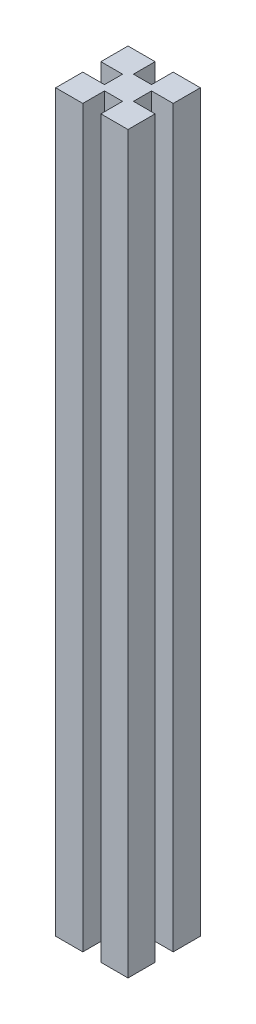
ISO-10303-21;
HEADER;
FILE_DESCRIPTION(('STEP AP214'),'2;1');
FILE_NAME('part.step','',(''),(''),'','','');
FILE_SCHEMA(('AUTOMOTIVE_DESIGN { 1 0 10303 214 1 1 1 1 }'));
ENDSEC;
DATA;
#1=APPLICATION_CONTEXT('core data for automotive mechanical design processes');
#2=APPLICATION_PROTOCOL_DEFINITION('international standard','automotive_design',2000,#1);
#3=PRODUCT_CONTEXT('',#1,'mechanical');
#4=PRODUCT('Part','Part','',(#3));
#5=PRODUCT_RELATED_PRODUCT_CATEGORY('part','',(#4));
#6=PRODUCT_DEFINITION_FORMATION('','',#4);
#7=PRODUCT_DEFINITION_CONTEXT('part definition',#1,'design');
#8=PRODUCT_DEFINITION('design','',#6,#7);
#9=PRODUCT_DEFINITION_SHAPE('','',#8);
#10=(LENGTH_UNIT() NAMED_UNIT(*) SI_UNIT(.MILLI.,.METRE.));
#11=(NAMED_UNIT(*) PLANE_ANGLE_UNIT() SI_UNIT($,.RADIAN.));
#12=(NAMED_UNIT(*) SI_UNIT($,.STERADIAN.) SOLID_ANGLE_UNIT());
#13=UNCERTAINTY_MEASURE_WITH_UNIT(LENGTH_MEASURE(1.E-05),#10,'distance_accuracy_value','');
#14=(GEOMETRIC_REPRESENTATION_CONTEXT(3) GLOBAL_UNCERTAINTY_ASSIGNED_CONTEXT((#13)) GLOBAL_UNIT_ASSIGNED_CONTEXT((#10,
#11,#12)) REPRESENTATION_CONTEXT('',''));
#15=CARTESIAN_POINT('',(0.,0.,0.));
#16=DIRECTION('',(0.,0.,1.));
#17=DIRECTION('',(1.,0.,0.));
#18=AXIS2_PLACEMENT_3D('',#15,#16,#17);
#19=CARTESIAN_POINT('',(10.,-101.6,10.));
#20=DIRECTION('',(1.,0.,0.));
#21=DIRECTION('',(0.,0.,-1.));
#22=AXIS2_PLACEMENT_3D('',#19,#20,#21);
#23=PLANE('',#22);
#24=DIRECTION('',(0.,-1.,0.));
#25=VECTOR('',#24,1.);
#26=CARTESIAN_POINT('',(10.,-101.6,2.5));
#27=LINE('',#26,#25);
#28=CARTESIAN_POINT('',(10.,101.6,2.5));
#29=VERTEX_POINT('',#28);
#30=CARTESIAN_POINT('',(10.,-101.6,2.5));
#31=VERTEX_POINT('',#30);
#32=EDGE_CURVE('E263',#29,#31,#27,.T.);
#33=ORIENTED_EDGE('',*,*,#32,.F.);
#34=DIRECTION('',(0.,0.,-1.));
#35=VECTOR('',#34,1.);
#36=CARTESIAN_POINT('',(10.,101.6,10.));
#37=LINE('',#36,#35);
#38=CARTESIAN_POINT('',(10.,101.6,10.));
#39=VERTEX_POINT('',#38);
#40=EDGE_CURVE('E269',#39,#29,#37,.T.);
#41=ORIENTED_EDGE('',*,*,#40,.F.);
#42=DIRECTION('',(0.,1.,0.));
#43=VECTOR('',#42,1.);
#44=CARTESIAN_POINT('',(10.,-101.6,10.));
#45=LINE('',#44,#43);
#46=CARTESIAN_POINT('',(10.,-101.6,10.));
#47=VERTEX_POINT('',#46);
#48=EDGE_CURVE('E300',#47,#39,#45,.T.);
#49=ORIENTED_EDGE('',*,*,#48,.F.);
#50=DIRECTION('',(0.,0.,-1.));
#51=VECTOR('',#50,1.);
#52=CARTESIAN_POINT('',(10.,-101.6,10.));
#53=LINE('',#52,#51);
#54=EDGE_CURVE('E284',#47,#31,#53,.T.);
#55=ORIENTED_EDGE('',*,*,#54,.T.);
#56=EDGE_LOOP('',(#33,#41,#49,#55));
#57=FACE_BOUND('',#56,.T.);
#58=ADVANCED_FACE('F32',(#57),#23,.T.);
#59=CARTESIAN_POINT('',(-10.,-101.6,10.));
#60=DIRECTION('',(0.,0.,1.));
#61=DIRECTION('',(1.,0.,0.));
#62=AXIS2_PLACEMENT_3D('',#59,#60,#61);
#63=PLANE('',#62);
#64=DIRECTION('',(0.,1.,0.));
#65=VECTOR('',#64,1.);
#66=CARTESIAN_POINT('',(2.5,-101.6,10.));
#67=LINE('',#66,#65);
#68=CARTESIAN_POINT('',(2.5,-101.6,10.));
#69=VERTEX_POINT('',#68);
#70=CARTESIAN_POINT('',(2.5,101.6,10.));
#71=VERTEX_POINT('',#70);
#72=EDGE_CURVE('E256',#69,#71,#67,.T.);
#73=ORIENTED_EDGE('',*,*,#72,.F.);
#74=DIRECTION('',(1.,0.,0.));
#75=VECTOR('',#74,1.);
#76=CARTESIAN_POINT('',(-10.,-101.6,10.));
#77=LINE('',#76,#75);
#78=EDGE_CURVE('E295',#69,#47,#77,.T.);
#79=ORIENTED_EDGE('',*,*,#78,.T.);
#80=ORIENTED_EDGE('',*,*,#48,.T.);
#81=DIRECTION('',(1.,0.,0.));
#82=VECTOR('',#81,1.);
#83=CARTESIAN_POINT('',(-10.,101.6,10.));
#84=LINE('',#83,#82);
#85=EDGE_CURVE('E279',#71,#39,#84,.T.);
#86=ORIENTED_EDGE('',*,*,#85,.F.);
#87=EDGE_LOOP('',(#73,#79,#80,#86));
#88=FACE_BOUND('',#87,.T.);
#89=ADVANCED_FACE('F374',(#88),#63,.T.);
#90=CARTESIAN_POINT('',(-10.,-101.6,10.));
#91=DIRECTION('',(-1.,0.,0.));
#92=DIRECTION('',(0.,0.,1.));
#93=AXIS2_PLACEMENT_3D('',#90,#91,#92);
#94=PLANE('',#93);
#95=DIRECTION('',(0.,-1.,0.));
#96=VECTOR('',#95,1.);
#97=CARTESIAN_POINT('',(-10.,-101.6,-2.5));
#98=LINE('',#97,#96);
#99=CARTESIAN_POINT('',(-10.,101.6,-2.5));
#100=VERTEX_POINT('',#99);
#101=CARTESIAN_POINT('',(-10.,-101.6,-2.5));
#102=VERTEX_POINT('',#101);
#103=EDGE_CURVE('E259',#100,#102,#98,.T.);
#104=ORIENTED_EDGE('',*,*,#103,.F.);
#105=DIRECTION('',(0.,0.,1.));
#106=VECTOR('',#105,1.);
#107=CARTESIAN_POINT('',(-10.,101.6,10.));
#108=LINE('',#107,#106);
#109=CARTESIAN_POINT('',(-10.,101.6,-10.));
#110=VERTEX_POINT('',#109);
#111=EDGE_CURVE('E276',#110,#100,#108,.T.);
#112=ORIENTED_EDGE('',*,*,#111,.F.);
#113=DIRECTION('',(0.,1.,0.));
#114=VECTOR('',#113,1.);
#115=CARTESIAN_POINT('',(-10.,-101.6,-10.));
#116=LINE('',#115,#114);
#117=CARTESIAN_POINT('',(-10.,-101.6,-10.));
#118=VERTEX_POINT('',#117);
#119=EDGE_CURVE('E307',#118,#110,#116,.T.);
#120=ORIENTED_EDGE('',*,*,#119,.F.);
#121=DIRECTION('',(0.,0.,1.));
#122=VECTOR('',#121,1.);
#123=CARTESIAN_POINT('',(-10.,-101.6,10.));
#124=LINE('',#123,#122);
#125=EDGE_CURVE('E292',#118,#102,#124,.T.);
#126=ORIENTED_EDGE('',*,*,#125,.T.);
#127=EDGE_LOOP('',(#104,#112,#120,#126));
#128=FACE_BOUND('',#127,.T.);
#129=ADVANCED_FACE('F344',(#128),#94,.T.);
#130=CARTESIAN_POINT('',(-10.,-101.6,-10.));
#131=DIRECTION('',(0.,0.,-1.));
#132=DIRECTION('',(-1.,0.,0.));
#133=AXIS2_PLACEMENT_3D('',#130,#131,#132);
#134=PLANE('',#133);
#135=DIRECTION('',(0.,-1.,0.));
#136=VECTOR('',#135,1.);
#137=CARTESIAN_POINT('',(2.5,-101.6,-10.));
#138=LINE('',#137,#136);
#139=CARTESIAN_POINT('',(2.5,101.6,-10.));
#140=VERTEX_POINT('',#139);
#141=CARTESIAN_POINT('',(2.5,-101.6,-10.));
#142=VERTEX_POINT('',#141);
#143=EDGE_CURVE('E266',#140,#142,#138,.T.);
#144=ORIENTED_EDGE('',*,*,#143,.F.);
#145=DIRECTION('',(-1.,0.,0.));
#146=VECTOR('',#145,1.);
#147=CARTESIAN_POINT('',(-10.,101.6,-10.));
#148=LINE('',#147,#146);
#149=CARTESIAN_POINT('',(10.,101.6,-10.));
#150=VERTEX_POINT('',#149);
#151=EDGE_CURVE('E273',#150,#140,#148,.T.);
#152=ORIENTED_EDGE('',*,*,#151,.F.);
#153=DIRECTION('',(0.,1.,0.));
#154=VECTOR('',#153,1.);
#155=CARTESIAN_POINT('',(10.,-101.6,-10.));
#156=LINE('',#155,#154);
#157=CARTESIAN_POINT('',(10.,-101.6,-10.));
#158=VERTEX_POINT('',#157);
#159=EDGE_CURVE('E299',#158,#150,#156,.T.);
#160=ORIENTED_EDGE('',*,*,#159,.F.);
#161=DIRECTION('',(-1.,0.,0.));
#162=VECTOR('',#161,1.);
#163=CARTESIAN_POINT('',(-10.,-101.6,-10.));
#164=LINE('',#163,#162);
#165=EDGE_CURVE('E288',#158,#142,#164,.T.);
#166=ORIENTED_EDGE('',*,*,#165,.T.);
#167=EDGE_LOOP('',(#144,#152,#160,#166));
#168=FACE_BOUND('',#167,.T.);
#169=ADVANCED_FACE('F328',(#168),#134,.T.);
#170=DIRECTION('',(0.,1.,0.));
#171=VECTOR('',#170,1.);
#172=CARTESIAN_POINT('',(10.,-101.6,-2.5));
#173=LINE('',#172,#171);
#174=CARTESIAN_POINT('',(10.,-101.6,-2.5));
#175=VERTEX_POINT('',#174);
#176=CARTESIAN_POINT('',(10.,101.6,-2.5));
#177=VERTEX_POINT('',#176);
#178=EDGE_CURVE('E261',#175,#177,#173,.T.);
#179=ORIENTED_EDGE('',*,*,#178,.F.);
#180=EDGE_CURVE('E283',#175,#158,#53,.T.);
#181=ORIENTED_EDGE('',*,*,#180,.T.);
#182=ORIENTED_EDGE('',*,*,#159,.T.);
#183=EDGE_CURVE('E268',#177,#150,#37,.T.);
#184=ORIENTED_EDGE('',*,*,#183,.F.);
#185=EDGE_LOOP('',(#179,#181,#182,#184));
#186=FACE_BOUND('',#185,.T.);
#187=ADVANCED_FACE('F34',(#186),#23,.T.);
#188=DIRECTION('',(0.,-1.,0.));
#189=VECTOR('',#188,1.);
#190=CARTESIAN_POINT('',(-2.5,-101.6,10.));
#191=LINE('',#190,#189);
#192=CARTESIAN_POINT('',(-2.5,101.6,10.));
#193=VERTEX_POINT('',#192);
#194=CARTESIAN_POINT('',(-2.5,-101.6,10.));
#195=VERTEX_POINT('',#194);
#196=EDGE_CURVE('E200',#193,#195,#191,.T.);
#197=ORIENTED_EDGE('',*,*,#196,.F.);
#198=CARTESIAN_POINT('',(-10.,101.6,10.));
#199=VERTEX_POINT('',#198);
#200=EDGE_CURVE('E280',#199,#193,#84,.T.);
#201=ORIENTED_EDGE('',*,*,#200,.F.);
#202=DIRECTION('',(0.,1.,0.));
#203=VECTOR('',#202,1.);
#204=CARTESIAN_POINT('',(-10.,-101.6,10.));
#205=LINE('',#204,#203);
#206=CARTESIAN_POINT('',(-10.,-101.6,10.));
#207=VERTEX_POINT('',#206);
#208=EDGE_CURVE('E304',#207,#199,#205,.T.);
#209=ORIENTED_EDGE('',*,*,#208,.F.);
#210=EDGE_CURVE('E296',#207,#195,#77,.T.);
#211=ORIENTED_EDGE('',*,*,#210,.T.);
#212=EDGE_LOOP('',(#197,#201,#209,#211));
#213=FACE_BOUND('',#212,.T.);
#214=ADVANCED_FACE('F360',(#213),#63,.T.);
#215=DIRECTION('',(0.,1.,0.));
#216=VECTOR('',#215,1.);
#217=CARTESIAN_POINT('',(-10.,-101.6,2.5));
#218=LINE('',#217,#216);
#219=CARTESIAN_POINT('',(-10.,-101.6,2.5));
#220=VERTEX_POINT('',#219);
#221=CARTESIAN_POINT('',(-10.,101.6,2.5));
#222=VERTEX_POINT('',#221);
#223=EDGE_CURVE('E55',#220,#222,#218,.T.);
#224=ORIENTED_EDGE('',*,*,#223,.F.);
#225=EDGE_CURVE('E291',#220,#207,#124,.T.);
#226=ORIENTED_EDGE('',*,*,#225,.T.);
#227=ORIENTED_EDGE('',*,*,#208,.T.);
#228=EDGE_CURVE('E275',#222,#199,#108,.T.);
#229=ORIENTED_EDGE('',*,*,#228,.F.);
#230=EDGE_LOOP('',(#224,#226,#227,#229));
#231=FACE_BOUND('',#230,.T.);
#232=ADVANCED_FACE('F354',(#231),#94,.T.);
#233=DIRECTION('',(0.,1.,0.));
#234=VECTOR('',#233,1.);
#235=CARTESIAN_POINT('',(-2.5,-101.6,-10.));
#236=LINE('',#235,#234);
#237=CARTESIAN_POINT('',(-2.5,-101.6,-10.));
#238=VERTEX_POINT('',#237);
#239=CARTESIAN_POINT('',(-2.5,101.6,-10.));
#240=VERTEX_POINT('',#239);
#241=EDGE_CURVE('E173',#238,#240,#236,.T.);
#242=ORIENTED_EDGE('',*,*,#241,.F.);
#243=EDGE_CURVE('E287',#238,#118,#164,.T.);
#244=ORIENTED_EDGE('',*,*,#243,.T.);
#245=ORIENTED_EDGE('',*,*,#119,.T.);
#246=EDGE_CURVE('E272',#240,#110,#148,.T.);
#247=ORIENTED_EDGE('',*,*,#246,.F.);
#248=EDGE_LOOP('',(#242,#244,#245,#247));
#249=FACE_BOUND('',#248,.T.);
#250=ADVANCED_FACE('F337',(#249),#134,.T.);
#251=CARTESIAN_POINT('',(0.,-101.6,0.));
#252=DIRECTION('',(0.,-1.,0.));
#253=DIRECTION('',(0.,0.,-1.));
#254=AXIS2_PLACEMENT_3D('',#251,#252,#253);
#255=PLANE('',#254);
#256=DIRECTION('',(0.,0.,-1.));
#257=VECTOR('',#256,1.);
#258=CARTESIAN_POINT('',(2.5,-101.6,-4.00000000000001));
#259=LINE('',#258,#257);
#260=CARTESIAN_POINT('',(2.5,-101.6,-4.00000000000001));
#261=VERTEX_POINT('',#260);
#262=EDGE_CURVE('E190',#261,#142,#259,.T.);
#263=ORIENTED_EDGE('',*,*,#262,.T.);
#264=ORIENTED_EDGE('',*,*,#165,.F.);
#265=ORIENTED_EDGE('',*,*,#180,.F.);
#266=DIRECTION('',(-1.,0.,0.));
#267=VECTOR('',#266,1.);
#268=CARTESIAN_POINT('',(4.,-101.6,-2.5));
#269=LINE('',#268,#267);
#270=CARTESIAN_POINT('',(4.,-101.6,-2.5));
#271=VERTEX_POINT('',#270);
#272=EDGE_CURVE('E208',#175,#271,#269,.T.);
#273=ORIENTED_EDGE('',*,*,#272,.T.);
#274=DIRECTION('',(0.,0.,1.));
#275=VECTOR('',#274,1.);
#276=CARTESIAN_POINT('',(4.,-101.6,-2.5));
#277=LINE('',#276,#275);
#278=CARTESIAN_POINT('',(4.,-101.6,2.5));
#279=VERTEX_POINT('',#278);
#280=EDGE_CURVE('E211',#271,#279,#277,.T.);
#281=ORIENTED_EDGE('',*,*,#280,.T.);
#282=DIRECTION('',(1.,0.,0.));
#283=VECTOR('',#282,1.);
#284=CARTESIAN_POINT('',(4.,-101.6,2.5));
#285=LINE('',#284,#283);
#286=EDGE_CURVE('E214',#279,#31,#285,.T.);
#287=ORIENTED_EDGE('',*,*,#286,.T.);
#288=ORIENTED_EDGE('',*,*,#54,.F.);
#289=ORIENTED_EDGE('',*,*,#78,.F.);
#290=DIRECTION('',(0.,0.,-1.));
#291=VECTOR('',#290,1.);
#292=CARTESIAN_POINT('',(2.5,-101.6,4.));
#293=LINE('',#292,#291);
#294=CARTESIAN_POINT('',(2.5,-101.6,4.));
#295=VERTEX_POINT('',#294);
#296=EDGE_CURVE('E249',#69,#295,#293,.T.);
#297=ORIENTED_EDGE('',*,*,#296,.T.);
#298=DIRECTION('',(-1.,0.,0.));
#299=VECTOR('',#298,1.);
#300=CARTESIAN_POINT('',(-2.5,-101.6,4.));
#301=LINE('',#300,#299);
#302=CARTESIAN_POINT('',(-2.5,-101.6,4.));
#303=VERTEX_POINT('',#302);
#304=EDGE_CURVE('E243',#295,#303,#301,.T.);
#305=ORIENTED_EDGE('',*,*,#304,.T.);
#306=DIRECTION('',(0.,0.,1.));
#307=VECTOR('',#306,1.);
#308=CARTESIAN_POINT('',(-2.5,-101.6,4.));
#309=LINE('',#308,#307);
#310=EDGE_CURVE('E246',#303,#195,#309,.T.);
#311=ORIENTED_EDGE('',*,*,#310,.T.);
#312=ORIENTED_EDGE('',*,*,#210,.F.);
#313=ORIENTED_EDGE('',*,*,#225,.F.);
#314=DIRECTION('',(1.,0.,0.));
#315=VECTOR('',#314,1.);
#316=CARTESIAN_POINT('',(-4.00000000000001,-101.6,2.5));
#317=LINE('',#316,#315);
#318=CARTESIAN_POINT('',(-4.00000000000001,-101.6,2.5));
#319=VERTEX_POINT('',#318);
#320=EDGE_CURVE('E230',#220,#319,#317,.T.);
#321=ORIENTED_EDGE('',*,*,#320,.T.);
#322=DIRECTION('',(0.,0.,-1.));
#323=VECTOR('',#322,1.);
#324=CARTESIAN_POINT('',(-4.00000000000001,-101.6,-2.5));
#325=LINE('',#324,#323);
#326=CARTESIAN_POINT('',(-4.00000000000001,-101.6,-2.5));
#327=VERTEX_POINT('',#326);
#328=EDGE_CURVE('E233',#319,#327,#325,.T.);
#329=ORIENTED_EDGE('',*,*,#328,.T.);
#330=DIRECTION('',(-1.,0.,0.));
#331=VECTOR('',#330,1.);
#332=CARTESIAN_POINT('',(-4.00000000000001,-101.6,-2.5));
#333=LINE('',#332,#331);
#334=EDGE_CURVE('E227',#327,#102,#333,.T.);
#335=ORIENTED_EDGE('',*,*,#334,.T.);
#336=ORIENTED_EDGE('',*,*,#125,.F.);
#337=ORIENTED_EDGE('',*,*,#243,.F.);
#338=DIRECTION('',(0.,0.,1.));
#339=VECTOR('',#338,1.);
#340=CARTESIAN_POINT('',(-2.5,-101.6,-4.00000000000001));
#341=LINE('',#340,#339);
#342=CARTESIAN_POINT('',(-2.5,-101.6,-4.00000000000001));
#343=VERTEX_POINT('',#342);
#344=EDGE_CURVE('E193',#238,#343,#341,.T.);
#345=ORIENTED_EDGE('',*,*,#344,.T.);
#346=DIRECTION('',(1.,0.,0.));
#347=VECTOR('',#346,1.);
#348=CARTESIAN_POINT('',(-2.5,-101.6,-4.00000000000001));
#349=LINE('',#348,#347);
#350=EDGE_CURVE('E183',#343,#261,#349,.T.);
#351=ORIENTED_EDGE('',*,*,#350,.T.);
#352=EDGE_LOOP('',(#263,#264,#265,#273,#281,#287,#288,#289,#297,#305,#311,#312,#313,#321,#329,
#335,#336,#337,#345,#351));
#353=FACE_BOUND('',#352,.T.);
#354=ADVANCED_FACE('F333',(#353),#255,.T.);
#355=CARTESIAN_POINT('',(0.,101.6,0.));
#356=DIRECTION('',(0.,-1.,0.));
#357=DIRECTION('',(0.,0.,-1.));
#358=AXIS2_PLACEMENT_3D('',#355,#356,#357);
#359=PLANE('',#358);
#360=ORIENTED_EDGE('',*,*,#151,.T.);
#361=DIRECTION('',(0.,0.,-1.));
#362=VECTOR('',#361,1.);
#363=CARTESIAN_POINT('',(2.5,101.6,-4.00000000000001));
#364=LINE('',#363,#362);
#365=CARTESIAN_POINT('',(2.5,101.6,-4.00000000000001));
#366=VERTEX_POINT('',#365);
#367=EDGE_CURVE('E189',#366,#140,#364,.T.);
#368=ORIENTED_EDGE('',*,*,#367,.F.);
#369=DIRECTION('',(1.,0.,0.));
#370=VECTOR('',#369,1.);
#371=CARTESIAN_POINT('',(-2.5,101.6,-4.00000000000001));
#372=LINE('',#371,#370);
#373=CARTESIAN_POINT('',(-2.5,101.6,-4.00000000000001));
#374=VERTEX_POINT('',#373);
#375=EDGE_CURVE('E180',#374,#366,#372,.T.);
#376=ORIENTED_EDGE('',*,*,#375,.F.);
#377=DIRECTION('',(0.,0.,-1.));
#378=VECTOR('',#377,1.);
#379=CARTESIAN_POINT('',(-2.5,101.6,0.));
#380=LINE('',#379,#378);
#381=EDGE_CURVE('E11',#374,#240,#380,.T.);
#382=ORIENTED_EDGE('',*,*,#381,.T.);
#383=ORIENTED_EDGE('',*,*,#246,.T.);
#384=ORIENTED_EDGE('',*,*,#111,.T.);
#385=DIRECTION('',(-1.,0.,0.));
#386=VECTOR('',#385,1.);
#387=CARTESIAN_POINT('',(-4.00000000000001,101.6,-2.5));
#388=LINE('',#387,#386);
#389=CARTESIAN_POINT('',(-4.00000000000001,101.6,-2.5));
#390=VERTEX_POINT('',#389);
#391=EDGE_CURVE('E221',#390,#100,#388,.T.);
#392=ORIENTED_EDGE('',*,*,#391,.F.);
#393=DIRECTION('',(0.,0.,-1.));
#394=VECTOR('',#393,1.);
#395=CARTESIAN_POINT('',(-4.00000000000001,101.6,-2.5));
#396=LINE('',#395,#394);
#397=CARTESIAN_POINT('',(-4.00000000000001,101.6,2.5));
#398=VERTEX_POINT('',#397);
#399=EDGE_CURVE('E223',#398,#390,#396,.T.);
#400=ORIENTED_EDGE('',*,*,#399,.F.);
#401=DIRECTION('',(-1.,0.,0.));
#402=VECTOR('',#401,1.);
#403=CARTESIAN_POINT('',(0.,101.6,2.5));
#404=LINE('',#403,#402);
#405=EDGE_CURVE('E314',#398,#222,#404,.T.);
#406=ORIENTED_EDGE('',*,*,#405,.T.);
#407=ORIENTED_EDGE('',*,*,#228,.T.);
#408=ORIENTED_EDGE('',*,*,#200,.T.);
#409=DIRECTION('',(0.,0.,1.));
#410=VECTOR('',#409,1.);
#411=CARTESIAN_POINT('',(-2.5,101.6,4.));
#412=LINE('',#411,#410);
#413=CARTESIAN_POINT('',(-2.5,101.6,4.));
#414=VERTEX_POINT('',#413);
#415=EDGE_CURVE('E241',#414,#193,#412,.T.);
#416=ORIENTED_EDGE('',*,*,#415,.F.);
#417=DIRECTION('',(-1.,0.,0.));
#418=VECTOR('',#417,1.);
#419=CARTESIAN_POINT('',(-2.5,101.6,4.));
#420=LINE('',#419,#418);
#421=CARTESIAN_POINT('',(2.5,101.6,4.));
#422=VERTEX_POINT('',#421);
#423=EDGE_CURVE('E47',#422,#414,#420,.T.);
#424=ORIENTED_EDGE('',*,*,#423,.F.);
#425=DIRECTION('',(0.,0.,1.));
#426=VECTOR('',#425,1.);
#427=CARTESIAN_POINT('',(2.5,101.6,0.));
#428=LINE('',#427,#426);
#429=EDGE_CURVE('E303',#422,#71,#428,.T.);
#430=ORIENTED_EDGE('',*,*,#429,.T.);
#431=ORIENTED_EDGE('',*,*,#85,.T.);
#432=ORIENTED_EDGE('',*,*,#40,.T.);
#433=DIRECTION('',(1.,0.,0.));
#434=VECTOR('',#433,1.);
#435=CARTESIAN_POINT('',(4.,101.6,2.5));
#436=LINE('',#435,#434);
#437=CARTESIAN_POINT('',(4.,101.6,2.5));
#438=VERTEX_POINT('',#437);
#439=EDGE_CURVE('E205',#438,#29,#436,.T.);
#440=ORIENTED_EDGE('',*,*,#439,.F.);
#441=DIRECTION('',(0.,0.,1.));
#442=VECTOR('',#441,1.);
#443=CARTESIAN_POINT('',(4.,101.6,-2.5));
#444=LINE('',#443,#442);
#445=CARTESIAN_POINT('',(4.,101.6,-2.5));
#446=VERTEX_POINT('',#445);
#447=EDGE_CURVE('E202',#446,#438,#444,.T.);
#448=ORIENTED_EDGE('',*,*,#447,.F.);
#449=DIRECTION('',(1.,0.,0.));
#450=VECTOR('',#449,1.);
#451=CARTESIAN_POINT('',(0.,101.6,-2.5));
#452=LINE('',#451,#450);
#453=EDGE_CURVE('E40',#446,#177,#452,.T.);
#454=ORIENTED_EDGE('',*,*,#453,.T.);
#455=ORIENTED_EDGE('',*,*,#183,.T.);
#456=EDGE_LOOP('',(#360,#368,#376,#382,#383,#384,#392,#400,#406,#407,#408,#416,#424,#430,#431,
#432,#440,#448,#454,#455));
#457=FACE_BOUND('',#456,.T.);
#458=ADVANCED_FACE('F188',(#457),#359,.F.);
#459=CARTESIAN_POINT('',(-2.5,-101.6,4.));
#460=DIRECTION('',(0.,0.,-1.));
#461=DIRECTION('',(-1.,0.,0.));
#462=AXIS2_PLACEMENT_3D('',#459,#460,#461);
#463=PLANE('',#462);
#464=DIRECTION('',(0.,1.,0.));
#465=VECTOR('',#464,1.);
#466=CARTESIAN_POINT('',(-2.5,-101.6,4.));
#467=LINE('',#466,#465);
#468=EDGE_CURVE('E252',#303,#414,#467,.T.);
#469=ORIENTED_EDGE('',*,*,#468,.F.);
#470=ORIENTED_EDGE('',*,*,#304,.F.);
#471=DIRECTION('',(0.,1.,0.));
#472=VECTOR('',#471,1.);
#473=CARTESIAN_POINT('',(2.5,-101.6,4.));
#474=LINE('',#473,#472);
#475=EDGE_CURVE('E224',#295,#422,#474,.T.);
#476=ORIENTED_EDGE('',*,*,#475,.T.);
#477=ORIENTED_EDGE('',*,*,#423,.T.);
#478=EDGE_LOOP('',(#469,#470,#476,#477));
#479=FACE_BOUND('',#478,.T.);
#480=ADVANCED_FACE('F366',(#479),#463,.F.);
#481=CARTESIAN_POINT('',(2.5,-101.6,4.));
#482=DIRECTION('',(1.,0.,0.));
#483=DIRECTION('',(0.,0.,-1.));
#484=AXIS2_PLACEMENT_3D('',#481,#482,#483);
#485=PLANE('',#484);
#486=ORIENTED_EDGE('',*,*,#72,.T.);
#487=ORIENTED_EDGE('',*,*,#429,.F.);
#488=ORIENTED_EDGE('',*,*,#475,.F.);
#489=ORIENTED_EDGE('',*,*,#296,.F.);
#490=EDGE_LOOP('',(#486,#487,#488,#489));
#491=FACE_BOUND('',#490,.T.);
#492=ADVANCED_FACE('F371',(#491),#485,.F.);
#493=CARTESIAN_POINT('',(-2.5,-101.6,4.));
#494=DIRECTION('',(-1.,0.,0.));
#495=DIRECTION('',(0.,0.,1.));
#496=AXIS2_PLACEMENT_3D('',#493,#494,#495);
#497=PLANE('',#496);
#498=ORIENTED_EDGE('',*,*,#196,.T.);
#499=ORIENTED_EDGE('',*,*,#310,.F.);
#500=ORIENTED_EDGE('',*,*,#468,.T.);
#501=ORIENTED_EDGE('',*,*,#415,.T.);
#502=EDGE_LOOP('',(#498,#499,#500,#501));
#503=FACE_BOUND('',#502,.T.);
#504=ADVANCED_FACE('F363',(#503),#497,.F.);
#505=CARTESIAN_POINT('',(-4.00000000000001,-101.6,-2.5));
#506=DIRECTION('',(0.,0.,-1.));
#507=DIRECTION('',(-1.,0.,0.));
#508=AXIS2_PLACEMENT_3D('',#505,#506,#507);
#509=PLANE('',#508);
#510=ORIENTED_EDGE('',*,*,#103,.T.);
#511=ORIENTED_EDGE('',*,*,#334,.F.);
#512=DIRECTION('',(0.,1.,0.));
#513=VECTOR('',#512,1.);
#514=CARTESIAN_POINT('',(-4.00000000000001,-101.6,-2.5));
#515=LINE('',#514,#513);
#516=EDGE_CURVE('E206',#327,#390,#515,.T.);
#517=ORIENTED_EDGE('',*,*,#516,.T.);
#518=ORIENTED_EDGE('',*,*,#391,.T.);
#519=EDGE_LOOP('',(#510,#511,#517,#518));
#520=FACE_BOUND('',#519,.T.);
#521=ADVANCED_FACE('F347',(#520),#509,.F.);
#522=CARTESIAN_POINT('',(-4.00000000000001,-101.6,-2.5));
#523=DIRECTION('',(1.,0.,0.));
#524=DIRECTION('',(0.,0.,-1.));
#525=AXIS2_PLACEMENT_3D('',#522,#523,#524);
#526=PLANE('',#525);
#527=ORIENTED_EDGE('',*,*,#516,.F.);
#528=ORIENTED_EDGE('',*,*,#328,.F.);
#529=DIRECTION('',(0.,1.,0.));
#530=VECTOR('',#529,1.);
#531=CARTESIAN_POINT('',(-4.00000000000001,-101.6,2.5));
#532=LINE('',#531,#530);
#533=EDGE_CURVE('E236',#319,#398,#532,.T.);
#534=ORIENTED_EDGE('',*,*,#533,.T.);
#535=ORIENTED_EDGE('',*,*,#399,.T.);
#536=EDGE_LOOP('',(#527,#528,#534,#535));
#537=FACE_BOUND('',#536,.T.);
#538=ADVANCED_FACE('F351',(#537),#526,.F.);
#539=CARTESIAN_POINT('',(-4.00000000000001,-101.6,2.5));
#540=DIRECTION('',(0.,0.,1.));
#541=DIRECTION('',(1.,0.,0.));
#542=AXIS2_PLACEMENT_3D('',#539,#540,#541);
#543=PLANE('',#542);
#544=ORIENTED_EDGE('',*,*,#223,.T.);
#545=ORIENTED_EDGE('',*,*,#405,.F.);
#546=ORIENTED_EDGE('',*,*,#533,.F.);
#547=ORIENTED_EDGE('',*,*,#320,.F.);
#548=EDGE_LOOP('',(#544,#545,#546,#547));
#549=FACE_BOUND('',#548,.T.);
#550=ADVANCED_FACE('F428',(#549),#543,.F.);
#551=CARTESIAN_POINT('',(4.,-101.6,2.5));
#552=DIRECTION('',(0.,0.,1.));
#553=DIRECTION('',(1.,0.,0.));
#554=AXIS2_PLACEMENT_3D('',#551,#552,#553);
#555=PLANE('',#554);
#556=ORIENTED_EDGE('',*,*,#32,.T.);
#557=ORIENTED_EDGE('',*,*,#286,.F.);
#558=DIRECTION('',(0.,1.,0.));
#559=VECTOR('',#558,1.);
#560=CARTESIAN_POINT('',(4.,-101.6,2.5));
#561=LINE('',#560,#559);
#562=EDGE_CURVE('E195',#279,#438,#561,.T.);
#563=ORIENTED_EDGE('',*,*,#562,.T.);
#564=ORIENTED_EDGE('',*,*,#439,.T.);
#565=EDGE_LOOP('',(#556,#557,#563,#564));
#566=FACE_BOUND('',#565,.T.);
#567=ADVANCED_FACE('F381',(#566),#555,.F.);
#568=CARTESIAN_POINT('',(4.,-101.6,-2.5));
#569=DIRECTION('',(-1.,0.,0.));
#570=DIRECTION('',(0.,0.,1.));
#571=AXIS2_PLACEMENT_3D('',#568,#569,#570);
#572=PLANE('',#571);
#573=ORIENTED_EDGE('',*,*,#562,.F.);
#574=ORIENTED_EDGE('',*,*,#280,.F.);
#575=DIRECTION('',(0.,1.,0.));
#576=VECTOR('',#575,1.);
#577=CARTESIAN_POINT('',(4.,-101.6,-2.5));
#578=LINE('',#577,#576);
#579=EDGE_CURVE('E217',#271,#446,#578,.T.);
#580=ORIENTED_EDGE('',*,*,#579,.T.);
#581=ORIENTED_EDGE('',*,*,#447,.T.);
#582=EDGE_LOOP('',(#573,#574,#580,#581));
#583=FACE_BOUND('',#582,.T.);
#584=ADVANCED_FACE('F384',(#583),#572,.F.);
#585=CARTESIAN_POINT('',(4.,-101.6,-2.5));
#586=DIRECTION('',(0.,0.,-1.));
#587=DIRECTION('',(-1.,0.,0.));
#588=AXIS2_PLACEMENT_3D('',#585,#586,#587);
#589=PLANE('',#588);
#590=ORIENTED_EDGE('',*,*,#178,.T.);
#591=ORIENTED_EDGE('',*,*,#453,.F.);
#592=ORIENTED_EDGE('',*,*,#579,.F.);
#593=ORIENTED_EDGE('',*,*,#272,.F.);
#594=EDGE_LOOP('',(#590,#591,#592,#593));
#595=FACE_BOUND('',#594,.T.);
#596=ADVANCED_FACE('F385',(#595),#589,.F.);
#597=CARTESIAN_POINT('',(2.5,-101.6,-4.00000000000001));
#598=DIRECTION('',(1.,0.,0.));
#599=DIRECTION('',(0.,0.,-1.));
#600=AXIS2_PLACEMENT_3D('',#597,#598,#599);
#601=PLANE('',#600);
#602=ORIENTED_EDGE('',*,*,#143,.T.);
#603=ORIENTED_EDGE('',*,*,#262,.F.);
#604=DIRECTION('',(0.,1.,0.));
#605=VECTOR('',#604,1.);
#606=CARTESIAN_POINT('',(2.5,-101.6,-4.00000000000001));
#607=LINE('',#606,#605);
#608=EDGE_CURVE('E185',#261,#366,#607,.T.);
#609=ORIENTED_EDGE('',*,*,#608,.T.);
#610=ORIENTED_EDGE('',*,*,#367,.T.);
#611=EDGE_LOOP('',(#602,#603,#609,#610));
#612=FACE_BOUND('',#611,.T.);
#613=ADVANCED_FACE('F331',(#612),#601,.F.);
#614=CARTESIAN_POINT('',(-2.5,-101.6,-4.00000000000001));
#615=DIRECTION('',(0.,0.,1.));
#616=DIRECTION('',(1.,0.,0.));
#617=AXIS2_PLACEMENT_3D('',#614,#615,#616);
#618=PLANE('',#617);
#619=ORIENTED_EDGE('',*,*,#608,.F.);
#620=ORIENTED_EDGE('',*,*,#350,.F.);
#621=DIRECTION('',(0.,1.,0.));
#622=VECTOR('',#621,1.);
#623=CARTESIAN_POINT('',(-2.5,-101.6,-4.00000000000001));
#624=LINE('',#623,#622);
#625=EDGE_CURVE('E170',#343,#374,#624,.T.);
#626=ORIENTED_EDGE('',*,*,#625,.T.);
#627=ORIENTED_EDGE('',*,*,#375,.T.);
#628=EDGE_LOOP('',(#619,#620,#626,#627));
#629=FACE_BOUND('',#628,.T.);
#630=ADVANCED_FACE('F179',(#629),#618,.F.);
#631=CARTESIAN_POINT('',(-2.5,-101.6,-4.00000000000001));
#632=DIRECTION('',(-1.,0.,0.));
#633=DIRECTION('',(0.,0.,1.));
#634=AXIS2_PLACEMENT_3D('',#631,#632,#633);
#635=PLANE('',#634);
#636=ORIENTED_EDGE('',*,*,#241,.T.);
#637=ORIENTED_EDGE('',*,*,#381,.F.);
#638=ORIENTED_EDGE('',*,*,#625,.F.);
#639=ORIENTED_EDGE('',*,*,#344,.F.);
#640=EDGE_LOOP('',(#636,#637,#638,#639));
#641=FACE_BOUND('',#640,.T.);
#642=ADVANCED_FACE('F169',(#641),#635,.F.);
#643=CLOSED_SHELL('',(#58,#89,#129,#169,#187,#214,#232,#250,#354,#458,#480,#492,#504,#521,#538,
#550,#567,#584,#596,#613,#630,#642));
#644=MANIFOLD_SOLID_BREP('B2',#643);
#645=ADVANCED_BREP_SHAPE_REPRESENTATION('',(#18,#644),#14);
#646=SHAPE_DEFINITION_REPRESENTATION(#9,#645);
ENDSEC;
END-ISO-10303-21;
